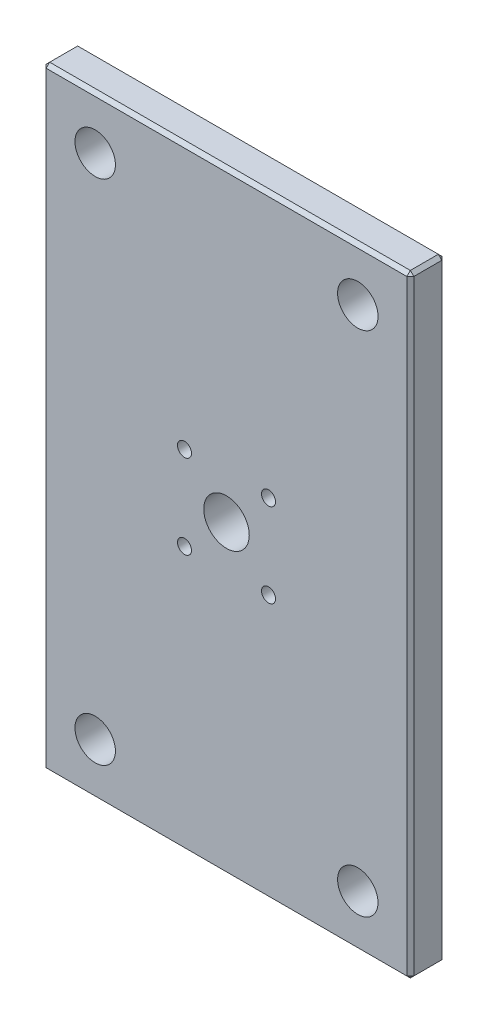
ISO-10303-21;
HEADER;
FILE_DESCRIPTION(('STEP AP214'),'2;1');
FILE_NAME('part.step','',(''),(''),'','','');
FILE_SCHEMA(('AUTOMOTIVE_DESIGN { 1 0 10303 214 1 1 1 1 }'));
ENDSEC;
DATA;
#1=APPLICATION_CONTEXT('core data for automotive mechanical design processes');
#2=APPLICATION_PROTOCOL_DEFINITION('international standard','automotive_design',2000,#1);
#3=PRODUCT_CONTEXT('',#1,'mechanical');
#4=PRODUCT('Part','Part','',(#3));
#5=PRODUCT_RELATED_PRODUCT_CATEGORY('part','',(#4));
#6=PRODUCT_DEFINITION_FORMATION('','',#4);
#7=PRODUCT_DEFINITION_CONTEXT('part definition',#1,'design');
#8=PRODUCT_DEFINITION('design','',#6,#7);
#9=PRODUCT_DEFINITION_SHAPE('','',#8);
#10=(LENGTH_UNIT() NAMED_UNIT(*) SI_UNIT(.MILLI.,.METRE.));
#11=(NAMED_UNIT(*) PLANE_ANGLE_UNIT() SI_UNIT($,.RADIAN.));
#12=(NAMED_UNIT(*) SI_UNIT($,.STERADIAN.) SOLID_ANGLE_UNIT());
#13=UNCERTAINTY_MEASURE_WITH_UNIT(LENGTH_MEASURE(1.E-05),#10,'distance_accuracy_value','');
#14=(GEOMETRIC_REPRESENTATION_CONTEXT(3) GLOBAL_UNCERTAINTY_ASSIGNED_CONTEXT((#13)) GLOBAL_UNIT_ASSIGNED_CONTEXT((#10,
#11,#12)) REPRESENTATION_CONTEXT('',''));
#15=CARTESIAN_POINT('',(0.,0.,0.));
#16=DIRECTION('',(0.,0.,1.));
#17=DIRECTION('',(1.,0.,0.));
#18=AXIS2_PLACEMENT_3D('',#15,#16,#17);
#19=CARTESIAN_POINT('',(0.,0.,40.));
#20=DIRECTION('',(1.,0.,0.));
#21=DIRECTION('',(0.,0.,-1.));
#22=AXIS2_PLACEMENT_3D('',#19,#20,#21);
#23=PLANE('',#22);
#24=DIRECTION('',(0.,0.,1.));
#25=VECTOR('',#24,1.);
#26=CARTESIAN_POINT('',(0.,4.,40.));
#27=LINE('',#26,#25);
#28=CARTESIAN_POINT('',(0.,4.,4.));
#29=VERTEX_POINT('',#28);
#30=CARTESIAN_POINT('',(0.,4.,36.));
#31=VERTEX_POINT('',#30);
#32=EDGE_CURVE('E238',#29,#31,#27,.T.);
#33=ORIENTED_EDGE('',*,*,#32,.T.);
#34=DIRECTION('',(0.,1.,0.));
#35=VECTOR('',#34,1.);
#36=CARTESIAN_POINT('',(0.,0.,36.));
#37=LINE('',#36,#35);
#38=CARTESIAN_POINT('',(0.,696.,36.));
#39=VERTEX_POINT('',#38);
#40=EDGE_CURVE('E240',#31,#39,#37,.T.);
#41=ORIENTED_EDGE('',*,*,#40,.T.);
#42=DIRECTION('',(0.,0.,-1.));
#43=VECTOR('',#42,1.);
#44=CARTESIAN_POINT('',(0.,696.,40.));
#45=LINE('',#44,#43);
#46=CARTESIAN_POINT('',(0.,696.,4.));
#47=VERTEX_POINT('',#46);
#48=EDGE_CURVE('E234',#39,#47,#45,.T.);
#49=ORIENTED_EDGE('',*,*,#48,.T.);
#50=DIRECTION('',(0.,-1.,0.));
#51=VECTOR('',#50,1.);
#52=CARTESIAN_POINT('',(0.,0.,4.));
#53=LINE('',#52,#51);
#54=EDGE_CURVE('E236',#47,#29,#53,.T.);
#55=ORIENTED_EDGE('',*,*,#54,.T.);
#56=EDGE_LOOP('',(#33,#41,#49,#55));
#57=FACE_BOUND('',#56,.T.);
#58=ADVANCED_FACE('F38',(#57),#23,.F.);
#59=CARTESIAN_POINT('',(0.,0.,40.));
#60=DIRECTION('',(0.,1.,0.));
#61=DIRECTION('',(0.,0.,1.));
#62=AXIS2_PLACEMENT_3D('',#59,#60,#61);
#63=PLANE('',#62);
#64=CARTESIAN_POINT('',(237.,0.,20.));
#65=DIRECTION('',(0.,-1.,0.));
#66=DIRECTION('',(0.,0.,-1.));
#67=AXIS2_PLACEMENT_3D('',#64,#65,#66);
#68=CIRCLE('',#67,1.64999999999998);
#69=CARTESIAN_POINT('',(237.,0.,18.35));
#70=VERTEX_POINT('',#69);
#71=EDGE_CURVE('E142',#70,#70,#68,.T.);
#72=ORIENTED_EDGE('',*,*,#71,.F.);
#73=EDGE_LOOP('',(#72));
#74=FACE_BOUND('',#73,.T.);
#75=CARTESIAN_POINT('',(183.,0.,20.));
#76=DIRECTION('',(0.,-1.,0.));
#77=DIRECTION('',(0.,0.,-1.));
#78=AXIS2_PLACEMENT_3D('',#75,#76,#77);
#79=CIRCLE('',#78,1.64999999999998);
#80=CARTESIAN_POINT('',(183.,0.,18.35));
#81=VERTEX_POINT('',#80);
#82=EDGE_CURVE('E141',#81,#81,#79,.T.);
#83=ORIENTED_EDGE('',*,*,#82,.F.);
#84=EDGE_LOOP('',(#83));
#85=FACE_BOUND('',#84,.T.);
#86=DIRECTION('',(-1.,0.,0.));
#87=VECTOR('',#86,1.);
#88=CARTESIAN_POINT('',(0.,0.,36.));
#89=LINE('',#88,#87);
#90=CARTESIAN_POINT('',(416.,0.,36.));
#91=VERTEX_POINT('',#90);
#92=CARTESIAN_POINT('',(4.,0.,36.));
#93=VERTEX_POINT('',#92);
#94=EDGE_CURVE('E220',#91,#93,#89,.T.);
#95=ORIENTED_EDGE('',*,*,#94,.T.);
#96=DIRECTION('',(0.,0.,-1.));
#97=VECTOR('',#96,1.);
#98=CARTESIAN_POINT('',(4.,0.,40.));
#99=LINE('',#98,#97);
#100=CARTESIAN_POINT('',(4.,0.,4.));
#101=VERTEX_POINT('',#100);
#102=EDGE_CURVE('E223',#93,#101,#99,.T.);
#103=ORIENTED_EDGE('',*,*,#102,.T.);
#104=DIRECTION('',(1.,0.,0.));
#105=VECTOR('',#104,1.);
#106=CARTESIAN_POINT('',(420.,0.,4.));
#107=LINE('',#106,#105);
#108=CARTESIAN_POINT('',(416.,0.,4.));
#109=VERTEX_POINT('',#108);
#110=EDGE_CURVE('E218',#101,#109,#107,.T.);
#111=ORIENTED_EDGE('',*,*,#110,.T.);
#112=DIRECTION('',(0.,0.,1.));
#113=VECTOR('',#112,1.);
#114=CARTESIAN_POINT('',(416.,0.,40.));
#115=LINE('',#114,#113);
#116=EDGE_CURVE('E216',#109,#91,#115,.T.);
#117=ORIENTED_EDGE('',*,*,#116,.T.);
#118=EDGE_LOOP('',(#95,#103,#111,#117));
#119=FACE_BOUND('',#118,.T.);
#120=ADVANCED_FACE('F400',(#74,#85,#119),#63,.F.);
#121=CARTESIAN_POINT('',(420.,0.,40.));
#122=DIRECTION('',(-1.,0.,0.));
#123=DIRECTION('',(0.,0.,1.));
#124=AXIS2_PLACEMENT_3D('',#121,#122,#123);
#125=PLANE('',#124);
#126=DIRECTION('',(0.,-1.,0.));
#127=VECTOR('',#126,1.);
#128=CARTESIAN_POINT('',(420.,0.,36.));
#129=LINE('',#128,#127);
#130=CARTESIAN_POINT('',(420.,696.,36.));
#131=VERTEX_POINT('',#130);
#132=CARTESIAN_POINT('',(420.,4.,36.));
#133=VERTEX_POINT('',#132);
#134=EDGE_CURVE('E47',#131,#133,#129,.T.);
#135=ORIENTED_EDGE('',*,*,#134,.T.);
#136=DIRECTION('',(0.,0.,-1.));
#137=VECTOR('',#136,1.);
#138=CARTESIAN_POINT('',(420.,4.,40.));
#139=LINE('',#138,#137);
#140=CARTESIAN_POINT('',(420.,4.,4.));
#141=VERTEX_POINT('',#140);
#142=EDGE_CURVE('E11',#133,#141,#139,.T.);
#143=ORIENTED_EDGE('',*,*,#142,.T.);
#144=DIRECTION('',(0.,1.,0.));
#145=VECTOR('',#144,1.);
#146=CARTESIAN_POINT('',(420.,700.,4.));
#147=LINE('',#146,#145);
#148=CARTESIAN_POINT('',(420.,696.,4.));
#149=VERTEX_POINT('',#148);
#150=EDGE_CURVE('E252',#141,#149,#147,.T.);
#151=ORIENTED_EDGE('',*,*,#150,.T.);
#152=DIRECTION('',(0.,0.,1.));
#153=VECTOR('',#152,1.);
#154=CARTESIAN_POINT('',(420.,696.,40.));
#155=LINE('',#154,#153);
#156=EDGE_CURVE('E58',#149,#131,#155,.T.);
#157=ORIENTED_EDGE('',*,*,#156,.T.);
#158=EDGE_LOOP('',(#135,#143,#151,#157));
#159=FACE_BOUND('',#158,.T.);
#160=ADVANCED_FACE('F405',(#159),#125,.F.);
#161=CARTESIAN_POINT('',(0.,700.,40.));
#162=DIRECTION('',(0.,-1.,0.));
#163=DIRECTION('',(0.,0.,-1.));
#164=AXIS2_PLACEMENT_3D('',#161,#162,#163);
#165=PLANE('',#164);
#166=DIRECTION('',(0.,0.,1.));
#167=VECTOR('',#166,1.);
#168=CARTESIAN_POINT('',(4.,700.,40.));
#169=LINE('',#168,#167);
#170=CARTESIAN_POINT('',(4.,700.,4.));
#171=VERTEX_POINT('',#170);
#172=CARTESIAN_POINT('',(4.,700.,36.));
#173=VERTEX_POINT('',#172);
#174=EDGE_CURVE('E247',#171,#173,#169,.T.);
#175=ORIENTED_EDGE('',*,*,#174,.T.);
#176=DIRECTION('',(1.,0.,0.));
#177=VECTOR('',#176,1.);
#178=CARTESIAN_POINT('',(0.,700.,36.));
#179=LINE('',#178,#177);
#180=CARTESIAN_POINT('',(416.,700.,36.));
#181=VERTEX_POINT('',#180);
#182=EDGE_CURVE('E249',#173,#181,#179,.T.);
#183=ORIENTED_EDGE('',*,*,#182,.T.);
#184=DIRECTION('',(0.,0.,-1.));
#185=VECTOR('',#184,1.);
#186=CARTESIAN_POINT('',(416.,700.,40.));
#187=LINE('',#186,#185);
#188=CARTESIAN_POINT('',(416.,700.,4.));
#189=VERTEX_POINT('',#188);
#190=EDGE_CURVE('E243',#181,#189,#187,.T.);
#191=ORIENTED_EDGE('',*,*,#190,.T.);
#192=DIRECTION('',(-1.,0.,0.));
#193=VECTOR('',#192,1.);
#194=CARTESIAN_POINT('',(0.,700.,4.));
#195=LINE('',#194,#193);
#196=EDGE_CURVE('E245',#189,#171,#195,.T.);
#197=ORIENTED_EDGE('',*,*,#196,.T.);
#198=EDGE_LOOP('',(#175,#183,#191,#197));
#199=FACE_BOUND('',#198,.T.);
#200=ADVANCED_FACE('F345',(#199),#165,.F.);
#201=CARTESIAN_POINT('',(0.,0.,40.));
#202=DIRECTION('',(0.,0.,-1.));
#203=DIRECTION('',(-1.,0.,0.));
#204=AXIS2_PLACEMENT_3D('',#201,#202,#203);
#205=PLANE('',#204);
#206=DIRECTION('',(0.,-1.,0.));
#207=VECTOR('',#206,1.);
#208=CARTESIAN_POINT('',(4.,0.,40.));
#209=LINE('',#208,#207);
#210=CARTESIAN_POINT('',(4.,696.,40.));
#211=VERTEX_POINT('',#210);
#212=CARTESIAN_POINT('',(4.,4.,40.));
#213=VERTEX_POINT('',#212);
#214=EDGE_CURVE('E211',#211,#213,#209,.T.);
#215=ORIENTED_EDGE('',*,*,#214,.T.);
#216=DIRECTION('',(1.,0.,0.));
#217=VECTOR('',#216,1.);
#218=CARTESIAN_POINT('',(0.,4.,40.));
#219=LINE('',#218,#217);
#220=CARTESIAN_POINT('',(416.,4.,40.));
#221=VERTEX_POINT('',#220);
#222=EDGE_CURVE('E213',#213,#221,#219,.T.);
#223=ORIENTED_EDGE('',*,*,#222,.T.);
#224=DIRECTION('',(0.,1.,0.));
#225=VECTOR('',#224,1.);
#226=CARTESIAN_POINT('',(416.,0.,40.));
#227=LINE('',#226,#225);
#228=CARTESIAN_POINT('',(416.,696.,40.));
#229=VERTEX_POINT('',#228);
#230=EDGE_CURVE('E205',#221,#229,#227,.T.);
#231=ORIENTED_EDGE('',*,*,#230,.T.);
#232=DIRECTION('',(-1.,0.,0.));
#233=VECTOR('',#232,1.);
#234=CARTESIAN_POINT('',(0.,696.,40.));
#235=LINE('',#234,#233);
#236=EDGE_CURVE('E209',#229,#211,#235,.T.);
#237=ORIENTED_EDGE('',*,*,#236,.T.);
#238=EDGE_LOOP('',(#215,#223,#231,#237));
#239=FACE_BOUND('',#238,.T.);
#240=CARTESIAN_POINT('',(162.,398.,40.));
#241=DIRECTION('',(0.,0.,1.));
#242=DIRECTION('',(1.,0.,0.));
#243=AXIS2_PLACEMENT_3D('',#240,#241,#242);
#244=CIRCLE('',#243,8.00000000000001);
#245=CARTESIAN_POINT('',(170.,398.,40.));
#246=VERTEX_POINT('',#245);
#247=EDGE_CURVE('E153',#246,#246,#244,.T.);
#248=ORIENTED_EDGE('',*,*,#247,.F.);
#249=EDGE_LOOP('',(#248));
#250=FACE_BOUND('',#249,.T.);
#251=CARTESIAN_POINT('',(258.,398.,40.));
#252=DIRECTION('',(0.,0.,1.));
#253=DIRECTION('',(1.,0.,0.));
#254=AXIS2_PLACEMENT_3D('',#251,#252,#253);
#255=CIRCLE('',#254,8.00000000000001);
#256=CARTESIAN_POINT('',(266.,398.,40.));
#257=VERTEX_POINT('',#256);
#258=EDGE_CURVE('E159',#257,#257,#255,.T.);
#259=ORIENTED_EDGE('',*,*,#258,.F.);
#260=EDGE_LOOP('',(#259));
#261=FACE_BOUND('',#260,.T.);
#262=CARTESIAN_POINT('',(258.,302.,40.));
#263=DIRECTION('',(0.,0.,1.));
#264=DIRECTION('',(1.,0.,0.));
#265=AXIS2_PLACEMENT_3D('',#262,#263,#264);
#266=CIRCLE('',#265,8.00000000000001);
#267=CARTESIAN_POINT('',(266.,302.,40.));
#268=VERTEX_POINT('',#267);
#269=EDGE_CURVE('E165',#268,#268,#266,.T.);
#270=ORIENTED_EDGE('',*,*,#269,.F.);
#271=EDGE_LOOP('',(#270));
#272=FACE_BOUND('',#271,.T.);
#273=CARTESIAN_POINT('',(162.,302.,40.));
#274=DIRECTION('',(0.,0.,1.));
#275=DIRECTION('',(1.,0.,0.));
#276=AXIS2_PLACEMENT_3D('',#273,#274,#275);
#277=CIRCLE('',#276,8.00000000000001);
#278=CARTESIAN_POINT('',(170.,302.,40.));
#279=VERTEX_POINT('',#278);
#280=EDGE_CURVE('E171',#279,#279,#277,.T.);
#281=ORIENTED_EDGE('',*,*,#280,.F.);
#282=EDGE_LOOP('',(#281));
#283=FACE_BOUND('',#282,.T.);
#284=CARTESIAN_POINT('',(210.,350.,40.));
#285=DIRECTION('',(0.,0.,1.));
#286=DIRECTION('',(1.,0.,0.));
#287=AXIS2_PLACEMENT_3D('',#284,#285,#286);
#288=CIRCLE('',#287,26.);
#289=CARTESIAN_POINT('',(236.,350.,40.));
#290=VERTEX_POINT('',#289);
#291=EDGE_CURVE('E177',#290,#290,#288,.T.);
#292=ORIENTED_EDGE('',*,*,#291,.F.);
#293=EDGE_LOOP('',(#292));
#294=FACE_BOUND('',#293,.T.);
#295=CARTESIAN_POINT('',(60.,640.,40.));
#296=DIRECTION('',(0.,0.,1.));
#297=DIRECTION('',(1.,0.,0.));
#298=AXIS2_PLACEMENT_3D('',#295,#296,#297);
#299=CIRCLE('',#298,23.1);
#300=CARTESIAN_POINT('',(83.1,640.,40.));
#301=VERTEX_POINT('',#300);
#302=EDGE_CURVE('E181',#301,#301,#299,.T.);
#303=ORIENTED_EDGE('',*,*,#302,.F.);
#304=EDGE_LOOP('',(#303));
#305=FACE_BOUND('',#304,.T.);
#306=CARTESIAN_POINT('',(360.,640.,40.));
#307=DIRECTION('',(0.,0.,1.));
#308=DIRECTION('',(1.,0.,0.));
#309=AXIS2_PLACEMENT_3D('',#306,#307,#308);
#310=CIRCLE('',#309,23.1);
#311=CARTESIAN_POINT('',(383.1,640.,40.));
#312=VERTEX_POINT('',#311);
#313=EDGE_CURVE('E187',#312,#312,#310,.T.);
#314=ORIENTED_EDGE('',*,*,#313,.F.);
#315=EDGE_LOOP('',(#314));
#316=FACE_BOUND('',#315,.T.);
#317=CARTESIAN_POINT('',(360.,60.,40.));
#318=DIRECTION('',(0.,0.,1.));
#319=DIRECTION('',(1.,0.,0.));
#320=AXIS2_PLACEMENT_3D('',#317,#318,#319);
#321=CIRCLE('',#320,23.1);
#322=CARTESIAN_POINT('',(383.1,60.,40.));
#323=VERTEX_POINT('',#322);
#324=EDGE_CURVE('E193',#323,#323,#321,.T.);
#325=ORIENTED_EDGE('',*,*,#324,.F.);
#326=EDGE_LOOP('',(#325));
#327=FACE_BOUND('',#326,.T.);
#328=CARTESIAN_POINT('',(60.,60.0000000000001,40.));
#329=DIRECTION('',(0.,0.,1.));
#330=DIRECTION('',(1.,0.,0.));
#331=AXIS2_PLACEMENT_3D('',#328,#329,#330);
#332=CIRCLE('',#331,23.1);
#333=CARTESIAN_POINT('',(83.1,60.0000000000001,40.));
#334=VERTEX_POINT('',#333);
#335=EDGE_CURVE('E199',#334,#334,#332,.T.);
#336=ORIENTED_EDGE('',*,*,#335,.F.);
#337=EDGE_LOOP('',(#336));
#338=FACE_BOUND('',#337,.T.);
#339=ADVANCED_FACE('F445',(#239,#250,#261,#272,#283,#294,#305,#316,#327,#338),#205,.F.);
#340=CARTESIAN_POINT('',(0.,0.,0.));
#341=DIRECTION('',(0.,0.,-1.));
#342=DIRECTION('',(-1.,0.,0.));
#343=AXIS2_PLACEMENT_3D('',#340,#341,#342);
#344=PLANE('',#343);
#345=DIRECTION('',(0.,-1.,0.));
#346=VECTOR('',#345,1.);
#347=CARTESIAN_POINT('',(416.,0.,0.));
#348=LINE('',#347,#346);
#349=CARTESIAN_POINT('',(416.,696.,0.));
#350=VERTEX_POINT('',#349);
#351=CARTESIAN_POINT('',(416.,4.,0.));
#352=VERTEX_POINT('',#351);
#353=EDGE_CURVE('E225',#350,#352,#348,.T.);
#354=ORIENTED_EDGE('',*,*,#353,.T.);
#355=DIRECTION('',(-1.,0.,0.));
#356=VECTOR('',#355,1.);
#357=CARTESIAN_POINT('',(0.,4.,0.));
#358=LINE('',#357,#356);
#359=CARTESIAN_POINT('',(4.,4.,0.));
#360=VERTEX_POINT('',#359);
#361=EDGE_CURVE('E231',#352,#360,#358,.T.);
#362=ORIENTED_EDGE('',*,*,#361,.T.);
#363=DIRECTION('',(0.,1.,0.));
#364=VECTOR('',#363,1.);
#365=CARTESIAN_POINT('',(4.,700.,0.));
#366=LINE('',#365,#364);
#367=CARTESIAN_POINT('',(4.,696.,0.));
#368=VERTEX_POINT('',#367);
#369=EDGE_CURVE('E229',#360,#368,#366,.T.);
#370=ORIENTED_EDGE('',*,*,#369,.T.);
#371=DIRECTION('',(1.,0.,0.));
#372=VECTOR('',#371,1.);
#373=CARTESIAN_POINT('',(420.,696.,0.));
#374=LINE('',#373,#372);
#375=EDGE_CURVE('E227',#368,#350,#374,.T.);
#376=ORIENTED_EDGE('',*,*,#375,.T.);
#377=EDGE_LOOP('',(#354,#362,#370,#376));
#378=FACE_BOUND('',#377,.T.);
#379=CARTESIAN_POINT('',(162.,398.,0.));
#380=DIRECTION('',(0.,0.,1.));
#381=DIRECTION('',(1.,0.,0.));
#382=AXIS2_PLACEMENT_3D('',#379,#380,#381);
#383=CIRCLE('',#382,7.99999999999998);
#384=CARTESIAN_POINT('',(170.,398.,0.));
#385=VERTEX_POINT('',#384);
#386=EDGE_CURVE('E156',#385,#385,#383,.T.);
#387=ORIENTED_EDGE('',*,*,#386,.T.);
#388=EDGE_LOOP('',(#387));
#389=FACE_BOUND('',#388,.T.);
#390=CARTESIAN_POINT('',(258.,398.,0.));
#391=DIRECTION('',(0.,0.,1.));
#392=DIRECTION('',(1.,0.,0.));
#393=AXIS2_PLACEMENT_3D('',#390,#391,#392);
#394=CIRCLE('',#393,8.00000000000001);
#395=CARTESIAN_POINT('',(266.,398.,0.));
#396=VERTEX_POINT('',#395);
#397=EDGE_CURVE('E162',#396,#396,#394,.T.);
#398=ORIENTED_EDGE('',*,*,#397,.T.);
#399=EDGE_LOOP('',(#398));
#400=FACE_BOUND('',#399,.T.);
#401=CARTESIAN_POINT('',(258.,302.,0.));
#402=DIRECTION('',(0.,0.,1.));
#403=DIRECTION('',(1.,0.,0.));
#404=AXIS2_PLACEMENT_3D('',#401,#402,#403);
#405=CIRCLE('',#404,8.00000000000001);
#406=CARTESIAN_POINT('',(266.,302.,0.));
#407=VERTEX_POINT('',#406);
#408=EDGE_CURVE('E168',#407,#407,#405,.T.);
#409=ORIENTED_EDGE('',*,*,#408,.T.);
#410=EDGE_LOOP('',(#409));
#411=FACE_BOUND('',#410,.T.);
#412=CARTESIAN_POINT('',(162.,302.,0.));
#413=DIRECTION('',(0.,0.,1.));
#414=DIRECTION('',(1.,0.,0.));
#415=AXIS2_PLACEMENT_3D('',#412,#413,#414);
#416=CIRCLE('',#415,7.99999999999998);
#417=CARTESIAN_POINT('',(170.,302.,0.));
#418=VERTEX_POINT('',#417);
#419=EDGE_CURVE('E174',#418,#418,#416,.T.);
#420=ORIENTED_EDGE('',*,*,#419,.T.);
#421=EDGE_LOOP('',(#420));
#422=FACE_BOUND('',#421,.T.);
#423=CARTESIAN_POINT('',(210.,350.,0.));
#424=DIRECTION('',(0.,0.,1.));
#425=DIRECTION('',(1.,0.,0.));
#426=AXIS2_PLACEMENT_3D('',#423,#424,#425);
#427=CIRCLE('',#426,26.);
#428=CARTESIAN_POINT('',(236.,350.,0.));
#429=VERTEX_POINT('',#428);
#430=EDGE_CURVE('E178',#429,#429,#427,.T.);
#431=ORIENTED_EDGE('',*,*,#430,.T.);
#432=EDGE_LOOP('',(#431));
#433=FACE_BOUND('',#432,.T.);
#434=CARTESIAN_POINT('',(60.,640.,0.));
#435=DIRECTION('',(0.,0.,1.));
#436=DIRECTION('',(1.,0.,0.));
#437=AXIS2_PLACEMENT_3D('',#434,#435,#436);
#438=CIRCLE('',#437,23.1);
#439=CARTESIAN_POINT('',(83.1,640.,0.));
#440=VERTEX_POINT('',#439);
#441=EDGE_CURVE('E184',#440,#440,#438,.T.);
#442=ORIENTED_EDGE('',*,*,#441,.T.);
#443=EDGE_LOOP('',(#442));
#444=FACE_BOUND('',#443,.T.);
#445=CARTESIAN_POINT('',(360.,640.,0.));
#446=DIRECTION('',(0.,0.,1.));
#447=DIRECTION('',(1.,0.,0.));
#448=AXIS2_PLACEMENT_3D('',#445,#446,#447);
#449=CIRCLE('',#448,23.1);
#450=CARTESIAN_POINT('',(383.1,640.,0.));
#451=VERTEX_POINT('',#450);
#452=EDGE_CURVE('E190',#451,#451,#449,.T.);
#453=ORIENTED_EDGE('',*,*,#452,.T.);
#454=EDGE_LOOP('',(#453));
#455=FACE_BOUND('',#454,.T.);
#456=CARTESIAN_POINT('',(360.,60.,0.));
#457=DIRECTION('',(0.,0.,1.));
#458=DIRECTION('',(1.,0.,0.));
#459=AXIS2_PLACEMENT_3D('',#456,#457,#458);
#460=CIRCLE('',#459,23.1);
#461=CARTESIAN_POINT('',(383.1,60.,0.));
#462=VERTEX_POINT('',#461);
#463=EDGE_CURVE('E196',#462,#462,#460,.T.);
#464=ORIENTED_EDGE('',*,*,#463,.T.);
#465=EDGE_LOOP('',(#464));
#466=FACE_BOUND('',#465,.T.);
#467=CARTESIAN_POINT('',(60.,60.0000000000001,0.));
#468=DIRECTION('',(0.,0.,1.));
#469=DIRECTION('',(1.,0.,0.));
#470=AXIS2_PLACEMENT_3D('',#467,#468,#469);
#471=CIRCLE('',#470,23.1);
#472=CARTESIAN_POINT('',(83.1,60.0000000000001,0.));
#473=VERTEX_POINT('',#472);
#474=EDGE_CURVE('E202',#473,#473,#471,.T.);
#475=ORIENTED_EDGE('',*,*,#474,.T.);
#476=EDGE_LOOP('',(#475));
#477=FACE_BOUND('',#476,.T.);
#478=ADVANCED_FACE('F365',(#378,#389,#400,#411,#422,#433,#444,#455,#466,#477),#344,.T.);
#479=CARTESIAN_POINT('',(60.,60.0000000000001,0.));
#480=DIRECTION('',(0.,0.,1.));
#481=DIRECTION('',(1.,0.,0.));
#482=AXIS2_PLACEMENT_3D('',#479,#480,#481);
#483=CYLINDRICAL_SURFACE('',#482,23.1);
#484=ORIENTED_EDGE('',*,*,#474,.F.);
#485=EDGE_LOOP('',(#484));
#486=FACE_BOUND('',#485,.T.);
#487=ORIENTED_EDGE('',*,*,#335,.T.);
#488=EDGE_LOOP('',(#487));
#489=FACE_BOUND('',#488,.T.);
#490=ADVANCED_FACE('F467',(#486,#489),#483,.F.);
#491=CARTESIAN_POINT('',(360.,60.,0.));
#492=DIRECTION('',(0.,0.,1.));
#493=DIRECTION('',(1.,0.,0.));
#494=AXIS2_PLACEMENT_3D('',#491,#492,#493);
#495=CYLINDRICAL_SURFACE('',#494,23.1);
#496=ORIENTED_EDGE('',*,*,#463,.F.);
#497=EDGE_LOOP('',(#496));
#498=FACE_BOUND('',#497,.T.);
#499=ORIENTED_EDGE('',*,*,#324,.T.);
#500=EDGE_LOOP('',(#499));
#501=FACE_BOUND('',#500,.T.);
#502=ADVANCED_FACE('F469',(#498,#501),#495,.F.);
#503=CARTESIAN_POINT('',(360.,640.,0.));
#504=DIRECTION('',(0.,0.,1.));
#505=DIRECTION('',(1.,0.,0.));
#506=AXIS2_PLACEMENT_3D('',#503,#504,#505);
#507=CYLINDRICAL_SURFACE('',#506,23.1);
#508=ORIENTED_EDGE('',*,*,#452,.F.);
#509=EDGE_LOOP('',(#508));
#510=FACE_BOUND('',#509,.T.);
#511=ORIENTED_EDGE('',*,*,#313,.T.);
#512=EDGE_LOOP('',(#511));
#513=FACE_BOUND('',#512,.T.);
#514=ADVANCED_FACE('F476',(#510,#513),#507,.F.);
#515=CARTESIAN_POINT('',(60.,640.,0.));
#516=DIRECTION('',(0.,0.,1.));
#517=DIRECTION('',(1.,0.,0.));
#518=AXIS2_PLACEMENT_3D('',#515,#516,#517);
#519=CYLINDRICAL_SURFACE('',#518,23.1);
#520=ORIENTED_EDGE('',*,*,#441,.F.);
#521=EDGE_LOOP('',(#520));
#522=FACE_BOUND('',#521,.T.);
#523=ORIENTED_EDGE('',*,*,#302,.T.);
#524=EDGE_LOOP('',(#523));
#525=FACE_BOUND('',#524,.T.);
#526=ADVANCED_FACE('F522',(#522,#525),#519,.F.);
#527=CARTESIAN_POINT('',(210.,350.,0.));
#528=DIRECTION('',(0.,0.,1.));
#529=DIRECTION('',(1.,0.,0.));
#530=AXIS2_PLACEMENT_3D('',#527,#528,#529);
#531=CYLINDRICAL_SURFACE('',#530,26.);
#532=ORIENTED_EDGE('',*,*,#430,.F.);
#533=EDGE_LOOP('',(#532));
#534=FACE_BOUND('',#533,.T.);
#535=ORIENTED_EDGE('',*,*,#291,.T.);
#536=EDGE_LOOP('',(#535));
#537=FACE_BOUND('',#536,.T.);
#538=ADVANCED_FACE('F531',(#534,#537),#531,.F.);
#539=CARTESIAN_POINT('',(162.,302.,40.));
#540=DIRECTION('',(0.,0.,1.));
#541=DIRECTION('',(1.,0.,0.));
#542=AXIS2_PLACEMENT_3D('',#539,#540,#541);
#543=CYLINDRICAL_SURFACE('',#542,7.99999999999999);
#544=ORIENTED_EDGE('',*,*,#419,.F.);
#545=EDGE_LOOP('',(#544));
#546=FACE_BOUND('',#545,.T.);
#547=ORIENTED_EDGE('',*,*,#280,.T.);
#548=EDGE_LOOP('',(#547));
#549=FACE_BOUND('',#548,.T.);
#550=ADVANCED_FACE('F541',(#546,#549),#543,.F.);
#551=CARTESIAN_POINT('',(258.,302.,40.));
#552=DIRECTION('',(0.,0.,1.));
#553=DIRECTION('',(1.,0.,0.));
#554=AXIS2_PLACEMENT_3D('',#551,#552,#553);
#555=CYLINDRICAL_SURFACE('',#554,8.00000000000001);
#556=ORIENTED_EDGE('',*,*,#408,.F.);
#557=EDGE_LOOP('',(#556));
#558=FACE_BOUND('',#557,.T.);
#559=ORIENTED_EDGE('',*,*,#269,.T.);
#560=EDGE_LOOP('',(#559));
#561=FACE_BOUND('',#560,.T.);
#562=ADVANCED_FACE('F780',(#558,#561),#555,.F.);
#563=CARTESIAN_POINT('',(258.,398.,40.));
#564=DIRECTION('',(0.,0.,1.));
#565=DIRECTION('',(1.,0.,0.));
#566=AXIS2_PLACEMENT_3D('',#563,#564,#565);
#567=CYLINDRICAL_SURFACE('',#566,8.00000000000001);
#568=ORIENTED_EDGE('',*,*,#397,.F.);
#569=EDGE_LOOP('',(#568));
#570=FACE_BOUND('',#569,.T.);
#571=ORIENTED_EDGE('',*,*,#258,.T.);
#572=EDGE_LOOP('',(#571));
#573=FACE_BOUND('',#572,.T.);
#574=ADVANCED_FACE('F770',(#570,#573),#567,.F.);
#575=CARTESIAN_POINT('',(162.,398.,40.));
#576=DIRECTION('',(0.,0.,1.));
#577=DIRECTION('',(1.,0.,0.));
#578=AXIS2_PLACEMENT_3D('',#575,#576,#577);
#579=CYLINDRICAL_SURFACE('',#578,7.99999999999999);
#580=ORIENTED_EDGE('',*,*,#386,.F.);
#581=EDGE_LOOP('',(#580));
#582=FACE_BOUND('',#581,.T.);
#583=ORIENTED_EDGE('',*,*,#247,.T.);
#584=EDGE_LOOP('',(#583));
#585=FACE_BOUND('',#584,.T.);
#586=ADVANCED_FACE('F552',(#582,#585),#579,.F.);
#587=CARTESIAN_POINT('',(0.,700.,4.));
#588=DIRECTION('',(0.,0.707106781186547,-0.707106781186547));
#589=DIRECTION('',(1.,0.,0.));
#590=AXIS2_PLACEMENT_3D('',#587,#588,#589);
#591=PLANE('',#590);
#592=DIRECTION('',(0.,-0.707106781186547,-0.707106781186547));
#593=VECTOR('',#592,1.);
#594=CARTESIAN_POINT('',(4.,696.,0.));
#595=LINE('',#594,#593);
#596=EDGE_CURVE('E42',#171,#368,#595,.T.);
#597=ORIENTED_EDGE('',*,*,#596,.F.);
#598=ORIENTED_EDGE('',*,*,#196,.F.);
#599=DIRECTION('',(0.,0.707106781186547,0.707106781186547));
#600=VECTOR('',#599,1.);
#601=CARTESIAN_POINT('',(416.,696.,0.));
#602=LINE('',#601,#600);
#603=EDGE_CURVE('E314',#350,#189,#602,.T.);
#604=ORIENTED_EDGE('',*,*,#603,.F.);
#605=ORIENTED_EDGE('',*,*,#375,.F.);
#606=EDGE_LOOP('',(#597,#598,#604,#605));
#607=FACE_BOUND('',#606,.T.);
#608=ADVANCED_FACE('F40',(#607),#591,.T.);
#609=CARTESIAN_POINT('',(4.,696.,0.));
#610=DIRECTION('',(-0.577350269189626,0.577350269189626,-0.577350269189626));
#611=DIRECTION('',(-0.707106781186547,0.,0.707106781186547));
#612=AXIS2_PLACEMENT_3D('',#609,#610,#611);
#613=PLANE('',#612);
#614=DIRECTION('',(-0.707106781186547,-0.707106781186547,0.));
#615=VECTOR('',#614,1.);
#616=CARTESIAN_POINT('',(2.,698.,4.));
#617=LINE('',#616,#615);
#618=EDGE_CURVE('E309',#171,#47,#617,.T.);
#619=ORIENTED_EDGE('',*,*,#618,.F.);
#620=ORIENTED_EDGE('',*,*,#596,.T.);
#621=DIRECTION('',(-0.707106781186547,0.,0.707106781186547));
#622=VECTOR('',#621,1.);
#623=CARTESIAN_POINT('',(4.,696.,0.));
#624=LINE('',#623,#622);
#625=EDGE_CURVE('E312',#47,#368,#624,.F.);
#626=ORIENTED_EDGE('',*,*,#625,.F.);
#627=EDGE_LOOP('',(#619,#620,#626));
#628=FACE_BOUND('',#627,.T.);
#629=ADVANCED_FACE('F325',(#628),#613,.T.);
#630=CARTESIAN_POINT('',(416.,696.,0.));
#631=DIRECTION('',(0.577350269189626,0.577350269189626,-0.577350269189626));
#632=DIRECTION('',(-0.707106781186547,0.,-0.707106781186547));
#633=AXIS2_PLACEMENT_3D('',#630,#631,#632);
#634=PLANE('',#633);
#635=DIRECTION('',(-0.707106781186547,0.,-0.707106781186547));
#636=VECTOR('',#635,1.);
#637=CARTESIAN_POINT('',(416.,696.,0.));
#638=LINE('',#637,#636);
#639=EDGE_CURVE('E303',#350,#149,#638,.F.);
#640=ORIENTED_EDGE('',*,*,#639,.F.);
#641=ORIENTED_EDGE('',*,*,#603,.T.);
#642=DIRECTION('',(-0.707106781186547,0.707106781186547,0.));
#643=VECTOR('',#642,1.);
#644=CARTESIAN_POINT('',(418.,698.,4.));
#645=LINE('',#644,#643);
#646=EDGE_CURVE('E306',#149,#189,#645,.T.);
#647=ORIENTED_EDGE('',*,*,#646,.F.);
#648=EDGE_LOOP('',(#640,#641,#647));
#649=FACE_BOUND('',#648,.T.);
#650=ADVANCED_FACE('F358',(#649),#634,.T.);
#651=CARTESIAN_POINT('',(0.,0.,4.));
#652=DIRECTION('',(-0.707106781186547,0.,-0.707106781186547));
#653=DIRECTION('',(0.,1.,0.));
#654=AXIS2_PLACEMENT_3D('',#651,#652,#653);
#655=PLANE('',#654);
#656=ORIENTED_EDGE('',*,*,#625,.T.);
#657=ORIENTED_EDGE('',*,*,#369,.F.);
#658=DIRECTION('',(0.707106781186547,0.,-0.707106781186547));
#659=VECTOR('',#658,1.);
#660=CARTESIAN_POINT('',(4.,4.,0.));
#661=LINE('',#660,#659);
#662=EDGE_CURVE('E298',#29,#360,#661,.T.);
#663=ORIENTED_EDGE('',*,*,#662,.F.);
#664=ORIENTED_EDGE('',*,*,#54,.F.);
#665=EDGE_LOOP('',(#656,#657,#663,#664));
#666=FACE_BOUND('',#665,.T.);
#667=ADVANCED_FACE('F333',(#666),#655,.T.);
#668=CARTESIAN_POINT('',(0.,696.,40.));
#669=DIRECTION('',(0.707106781186547,-0.707106781186547,0.));
#670=DIRECTION('',(0.,0.,-1.));
#671=AXIS2_PLACEMENT_3D('',#668,#669,#670);
#672=PLANE('',#671);
#673=ORIENTED_EDGE('',*,*,#618,.T.);
#674=ORIENTED_EDGE('',*,*,#48,.F.);
#675=DIRECTION('',(0.707106781186547,0.707106781186547,0.));
#676=VECTOR('',#675,1.);
#677=CARTESIAN_POINT('',(0.,696.,36.));
#678=LINE('',#677,#676);
#679=EDGE_CURVE('E295',#173,#39,#678,.F.);
#680=ORIENTED_EDGE('',*,*,#679,.F.);
#681=ORIENTED_EDGE('',*,*,#174,.F.);
#682=EDGE_LOOP('',(#673,#674,#680,#681));
#683=FACE_BOUND('',#682,.T.);
#684=ADVANCED_FACE('F342',(#683),#672,.F.);
#685=CARTESIAN_POINT('',(0.,696.,40.));
#686=DIRECTION('',(0.,-0.707106781186547,-0.707106781186547));
#687=DIRECTION('',(-1.,0.,0.));
#688=AXIS2_PLACEMENT_3D('',#685,#686,#687);
#689=PLANE('',#688);
#690=DIRECTION('',(0.,0.707106781186547,-0.707106781186547));
#691=VECTOR('',#690,1.);
#692=CARTESIAN_POINT('',(416.,700.,36.));
#693=LINE('',#692,#691);
#694=EDGE_CURVE('E289',#181,#229,#693,.F.);
#695=ORIENTED_EDGE('',*,*,#694,.F.);
#696=ORIENTED_EDGE('',*,*,#182,.F.);
#697=DIRECTION('',(0.,-0.707106781186547,0.707106781186547));
#698=VECTOR('',#697,1.);
#699=CARTESIAN_POINT('',(4.,698.,38.));
#700=LINE('',#699,#698);
#701=EDGE_CURVE('E292',#211,#173,#700,.F.);
#702=ORIENTED_EDGE('',*,*,#701,.F.);
#703=ORIENTED_EDGE('',*,*,#236,.F.);
#704=EDGE_LOOP('',(#695,#696,#702,#703));
#705=FACE_BOUND('',#704,.T.);
#706=ADVANCED_FACE('F349',(#705),#689,.F.);
#707=CARTESIAN_POINT('',(416.,700.,40.));
#708=DIRECTION('',(-0.707106781186547,-0.707106781186547,0.));
#709=DIRECTION('',(0.,0.,-1.));
#710=AXIS2_PLACEMENT_3D('',#707,#708,#709);
#711=PLANE('',#710);
#712=ORIENTED_EDGE('',*,*,#646,.T.);
#713=ORIENTED_EDGE('',*,*,#190,.F.);
#714=DIRECTION('',(0.707106781186547,-0.707106781186547,0.));
#715=VECTOR('',#714,1.);
#716=CARTESIAN_POINT('',(416.,700.,36.));
#717=LINE('',#716,#715);
#718=EDGE_CURVE('E287',#131,#181,#717,.F.);
#719=ORIENTED_EDGE('',*,*,#718,.F.);
#720=ORIENTED_EDGE('',*,*,#156,.F.);
#721=EDGE_LOOP('',(#712,#713,#719,#720));
#722=FACE_BOUND('',#721,.T.);
#723=ADVANCED_FACE('F356',(#722),#711,.F.);
#724=CARTESIAN_POINT('',(420.,0.,4.));
#725=DIRECTION('',(0.707106781186547,0.,-0.707106781186547));
#726=DIRECTION('',(0.,-1.,0.));
#727=AXIS2_PLACEMENT_3D('',#724,#725,#726);
#728=PLANE('',#727);
#729=ORIENTED_EDGE('',*,*,#639,.T.);
#730=ORIENTED_EDGE('',*,*,#150,.F.);
#731=DIRECTION('',(0.707106781186547,0.,0.707106781186547));
#732=VECTOR('',#731,1.);
#733=CARTESIAN_POINT('',(418.,4.,2.));
#734=LINE('',#733,#732);
#735=EDGE_CURVE('E284',#352,#141,#734,.T.);
#736=ORIENTED_EDGE('',*,*,#735,.F.);
#737=ORIENTED_EDGE('',*,*,#353,.F.);
#738=EDGE_LOOP('',(#729,#730,#736,#737));
#739=FACE_BOUND('',#738,.T.);
#740=ADVANCED_FACE('F362',(#739),#728,.T.);
#741=CARTESIAN_POINT('',(0.,0.,4.));
#742=DIRECTION('',(0.,-0.707106781186547,-0.707106781186547));
#743=DIRECTION('',(-1.,0.,0.));
#744=AXIS2_PLACEMENT_3D('',#741,#742,#743);
#745=PLANE('',#744);
#746=DIRECTION('',(0.,-0.707106781186547,0.707106781186547));
#747=VECTOR('',#746,1.);
#748=CARTESIAN_POINT('',(4.,4.,0.));
#749=LINE('',#748,#747);
#750=EDGE_CURVE('E300',#360,#101,#749,.T.);
#751=ORIENTED_EDGE('',*,*,#750,.F.);
#752=ORIENTED_EDGE('',*,*,#361,.F.);
#753=DIRECTION('',(0.,0.707106781186547,-0.707106781186547));
#754=VECTOR('',#753,1.);
#755=CARTESIAN_POINT('',(416.,0.,4.));
#756=LINE('',#755,#754);
#757=EDGE_CURVE('E281',#109,#352,#756,.T.);
#758=ORIENTED_EDGE('',*,*,#757,.F.);
#759=ORIENTED_EDGE('',*,*,#110,.F.);
#760=EDGE_LOOP('',(#751,#752,#758,#759));
#761=FACE_BOUND('',#760,.T.);
#762=ADVANCED_FACE('F370',(#761),#745,.T.);
#763=CARTESIAN_POINT('',(4.,4.,0.));
#764=DIRECTION('',(-0.577350269189626,-0.577350269189626,-0.577350269189626));
#765=DIRECTION('',(-0.707106781186547,0.,0.707106781186547));
#766=AXIS2_PLACEMENT_3D('',#763,#764,#765);
#767=PLANE('',#766);
#768=ORIENTED_EDGE('',*,*,#662,.T.);
#769=ORIENTED_EDGE('',*,*,#750,.T.);
#770=DIRECTION('',(0.707106781186547,-0.707106781186547,0.));
#771=VECTOR('',#770,1.);
#772=CARTESIAN_POINT('',(2.,2.,4.));
#773=LINE('',#772,#771);
#774=EDGE_CURVE('E278',#29,#101,#773,.T.);
#775=ORIENTED_EDGE('',*,*,#774,.F.);
#776=EDGE_LOOP('',(#768,#769,#775));
#777=FACE_BOUND('',#776,.T.);
#778=ADVANCED_FACE('F374',(#777),#767,.T.);
#779=CARTESIAN_POINT('',(0.,696.,36.));
#780=DIRECTION('',(-0.577350269189626,0.577350269189626,0.577350269189626));
#781=DIRECTION('',(0.707106781186547,0.,0.707106781186547));
#782=AXIS2_PLACEMENT_3D('',#779,#780,#781);
#783=PLANE('',#782);
#784=ORIENTED_EDGE('',*,*,#701,.T.);
#785=ORIENTED_EDGE('',*,*,#679,.T.);
#786=DIRECTION('',(-0.707106781186547,0.,-0.707106781186547));
#787=VECTOR('',#786,1.);
#788=CARTESIAN_POINT('',(0.,696.,36.));
#789=LINE('',#788,#787);
#790=EDGE_CURVE('E276',#211,#39,#789,.T.);
#791=ORIENTED_EDGE('',*,*,#790,.F.);
#792=EDGE_LOOP('',(#784,#785,#791));
#793=FACE_BOUND('',#792,.T.);
#794=ADVANCED_FACE('F388',(#793),#783,.T.);
#795=CARTESIAN_POINT('',(416.,700.,36.));
#796=DIRECTION('',(0.577350269189626,0.577350269189626,0.577350269189626));
#797=DIRECTION('',(0.707106781186547,0.,-0.707106781186547));
#798=AXIS2_PLACEMENT_3D('',#795,#796,#797);
#799=PLANE('',#798);
#800=ORIENTED_EDGE('',*,*,#718,.T.);
#801=ORIENTED_EDGE('',*,*,#694,.T.);
#802=DIRECTION('',(-0.707106781186547,0.,0.707106781186547));
#803=VECTOR('',#802,1.);
#804=CARTESIAN_POINT('',(418.,696.,38.));
#805=LINE('',#804,#803);
#806=EDGE_CURVE('E273',#131,#229,#805,.T.);
#807=ORIENTED_EDGE('',*,*,#806,.F.);
#808=EDGE_LOOP('',(#800,#801,#807));
#809=FACE_BOUND('',#808,.T.);
#810=ADVANCED_FACE('F390',(#809),#799,.T.);
#811=CARTESIAN_POINT('',(416.,0.,4.));
#812=DIRECTION('',(0.577350269189626,-0.577350269189626,-0.577350269189626));
#813=DIRECTION('',(-0.707106781186547,0.,-0.707106781186547));
#814=AXIS2_PLACEMENT_3D('',#811,#812,#813);
#815=PLANE('',#814);
#816=ORIENTED_EDGE('',*,*,#757,.T.);
#817=ORIENTED_EDGE('',*,*,#735,.T.);
#818=DIRECTION('',(0.707106781186547,0.707106781186547,0.));
#819=VECTOR('',#818,1.);
#820=CARTESIAN_POINT('',(416.,0.,4.));
#821=LINE('',#820,#819);
#822=EDGE_CURVE('E271',#109,#141,#821,.T.);
#823=ORIENTED_EDGE('',*,*,#822,.F.);
#824=EDGE_LOOP('',(#816,#817,#823));
#825=FACE_BOUND('',#824,.T.);
#826=ADVANCED_FACE('F396',(#825),#815,.T.);
#827=CARTESIAN_POINT('',(4.,0.,40.));
#828=DIRECTION('',(0.707106781186547,0.707106781186547,0.));
#829=DIRECTION('',(0.,0.,-1.));
#830=AXIS2_PLACEMENT_3D('',#827,#828,#829);
#831=PLANE('',#830);
#832=ORIENTED_EDGE('',*,*,#774,.T.);
#833=ORIENTED_EDGE('',*,*,#102,.F.);
#834=DIRECTION('',(-0.707106781186547,0.707106781186547,0.));
#835=VECTOR('',#834,1.);
#836=CARTESIAN_POINT('',(4.,0.,36.));
#837=LINE('',#836,#835);
#838=EDGE_CURVE('E268',#31,#93,#837,.F.);
#839=ORIENTED_EDGE('',*,*,#838,.F.);
#840=ORIENTED_EDGE('',*,*,#32,.F.);
#841=EDGE_LOOP('',(#832,#833,#839,#840));
#842=FACE_BOUND('',#841,.T.);
#843=ADVANCED_FACE('F377',(#842),#831,.F.);
#844=CARTESIAN_POINT('',(4.,0.,40.));
#845=DIRECTION('',(0.707106781186547,0.,-0.707106781186547));
#846=DIRECTION('',(0.,-1.,0.));
#847=AXIS2_PLACEMENT_3D('',#844,#845,#846);
#848=PLANE('',#847);
#849=ORIENTED_EDGE('',*,*,#790,.T.);
#850=ORIENTED_EDGE('',*,*,#40,.F.);
#851=DIRECTION('',(0.707106781186547,0.,0.707106781186547));
#852=VECTOR('',#851,1.);
#853=CARTESIAN_POINT('',(2.,4.,38.));
#854=LINE('',#853,#852);
#855=EDGE_CURVE('E265',#213,#31,#854,.F.);
#856=ORIENTED_EDGE('',*,*,#855,.F.);
#857=ORIENTED_EDGE('',*,*,#214,.F.);
#858=EDGE_LOOP('',(#849,#850,#856,#857));
#859=FACE_BOUND('',#858,.T.);
#860=ADVANCED_FACE('F386',(#859),#848,.F.);
#861=CARTESIAN_POINT('',(416.,0.,40.));
#862=DIRECTION('',(-0.707106781186547,0.,-0.707106781186547));
#863=DIRECTION('',(0.,1.,0.));
#864=AXIS2_PLACEMENT_3D('',#861,#862,#863);
#865=PLANE('',#864);
#866=ORIENTED_EDGE('',*,*,#806,.T.);
#867=ORIENTED_EDGE('',*,*,#230,.F.);
#868=DIRECTION('',(0.707106781186547,0.,-0.707106781186547));
#869=VECTOR('',#868,1.);
#870=CARTESIAN_POINT('',(416.,4.,40.));
#871=LINE('',#870,#869);
#872=EDGE_CURVE('E262',#133,#221,#871,.F.);
#873=ORIENTED_EDGE('',*,*,#872,.F.);
#874=ORIENTED_EDGE('',*,*,#134,.F.);
#875=EDGE_LOOP('',(#866,#867,#873,#874));
#876=FACE_BOUND('',#875,.T.);
#877=ADVANCED_FACE('F424',(#876),#865,.F.);
#878=CARTESIAN_POINT('',(420.,4.,40.));
#879=DIRECTION('',(-0.707106781186547,0.707106781186547,0.));
#880=DIRECTION('',(0.,0.,-1.));
#881=AXIS2_PLACEMENT_3D('',#878,#879,#880);
#882=PLANE('',#881);
#883=ORIENTED_EDGE('',*,*,#822,.T.);
#884=ORIENTED_EDGE('',*,*,#142,.F.);
#885=DIRECTION('',(-0.707106781186547,-0.707106781186547,0.));
#886=VECTOR('',#885,1.);
#887=CARTESIAN_POINT('',(418.,2.,36.));
#888=LINE('',#887,#886);
#889=EDGE_CURVE('E259',#91,#133,#888,.F.);
#890=ORIENTED_EDGE('',*,*,#889,.F.);
#891=ORIENTED_EDGE('',*,*,#116,.F.);
#892=EDGE_LOOP('',(#883,#884,#890,#891));
#893=FACE_BOUND('',#892,.T.);
#894=ADVANCED_FACE('F421',(#893),#882,.F.);
#895=CARTESIAN_POINT('',(4.,0.,36.));
#896=DIRECTION('',(-0.577350269189626,-0.577350269189626,0.577350269189626));
#897=DIRECTION('',(0.707106781186547,0.,0.707106781186547));
#898=AXIS2_PLACEMENT_3D('',#895,#896,#897);
#899=PLANE('',#898);
#900=ORIENTED_EDGE('',*,*,#855,.T.);
#901=ORIENTED_EDGE('',*,*,#838,.T.);
#902=DIRECTION('',(0.,-0.707106781186547,-0.707106781186547));
#903=VECTOR('',#902,1.);
#904=CARTESIAN_POINT('',(4.,0.,36.));
#905=LINE('',#904,#903);
#906=EDGE_CURVE('E257',#213,#93,#905,.T.);
#907=ORIENTED_EDGE('',*,*,#906,.F.);
#908=EDGE_LOOP('',(#900,#901,#907));
#909=FACE_BOUND('',#908,.T.);
#910=ADVANCED_FACE('F382',(#909),#899,.T.);
#911=CARTESIAN_POINT('',(416.,4.,40.));
#912=DIRECTION('',(0.577350269189626,-0.577350269189626,0.577350269189626));
#913=DIRECTION('',(0.707106781186547,0.,-0.707106781186547));
#914=AXIS2_PLACEMENT_3D('',#911,#912,#913);
#915=PLANE('',#914);
#916=ORIENTED_EDGE('',*,*,#889,.T.);
#917=ORIENTED_EDGE('',*,*,#872,.T.);
#918=DIRECTION('',(0.,0.707106781186547,0.707106781186547));
#919=VECTOR('',#918,1.);
#920=CARTESIAN_POINT('',(416.,4.,40.));
#921=LINE('',#920,#919);
#922=EDGE_CURVE('E152',#91,#221,#921,.T.);
#923=ORIENTED_EDGE('',*,*,#922,.F.);
#924=EDGE_LOOP('',(#916,#917,#923));
#925=FACE_BOUND('',#924,.T.);
#926=ADVANCED_FACE('F414',(#925),#915,.T.);
#927=CARTESIAN_POINT('',(0.,4.,40.));
#928=DIRECTION('',(0.,0.707106781186547,-0.707106781186547));
#929=DIRECTION('',(1.,0.,0.));
#930=AXIS2_PLACEMENT_3D('',#927,#928,#929);
#931=PLANE('',#930);
#932=ORIENTED_EDGE('',*,*,#906,.T.);
#933=ORIENTED_EDGE('',*,*,#94,.F.);
#934=ORIENTED_EDGE('',*,*,#922,.T.);
#935=ORIENTED_EDGE('',*,*,#222,.F.);
#936=EDGE_LOOP('',(#932,#933,#934,#935));
#937=FACE_BOUND('',#936,.T.);
#938=ADVANCED_FACE('F410',(#937),#931,.F.);
#939=CARTESIAN_POINT('',(183.,10.1,20.));
#940=DIRECTION('',(0.,-1.,0.));
#941=DIRECTION('',(0.,0.,-1.));
#942=AXIS2_PLACEMENT_3D('',#939,#940,#941);
#943=CONICAL_SURFACE('',#942,1.64999999999998,1.02974425867665);
#944=CARTESIAN_POINT('',(183.,11.0914200213955,20.));
#945=VERTEX_POINT('',#944);
#946=VERTEX_LOOP('',#945);
#947=FACE_BOUND('',#946,.T.);
#948=CARTESIAN_POINT('',(183.,10.1,20.));
#949=DIRECTION('',(0.,-1.,0.));
#950=DIRECTION('',(0.,0.,-1.));
#951=AXIS2_PLACEMENT_3D('',#948,#949,#950);
#952=CIRCLE('',#951,1.64999999999998);
#953=CARTESIAN_POINT('',(183.,10.1,18.35));
#954=VERTEX_POINT('',#953);
#955=EDGE_CURVE('E145',#954,#954,#952,.T.);
#956=ORIENTED_EDGE('',*,*,#955,.T.);
#957=EDGE_LOOP('',(#956));
#958=FACE_BOUND('',#957,.T.);
#959=ADVANCED_FACE('F413',(#947,#958),#943,.F.);
#960=CARTESIAN_POINT('',(183.,0.,20.));
#961=DIRECTION('',(0.,-1.,0.));
#962=DIRECTION('',(0.,0.,-1.));
#963=AXIS2_PLACEMENT_3D('',#960,#961,#962);
#964=CYLINDRICAL_SURFACE('',#963,1.64999999999998);
#965=ORIENTED_EDGE('',*,*,#955,.F.);
#966=EDGE_LOOP('',(#965));
#967=FACE_BOUND('',#966,.T.);
#968=ORIENTED_EDGE('',*,*,#82,.T.);
#969=EDGE_LOOP('',(#968));
#970=FACE_BOUND('',#969,.T.);
#971=ADVANCED_FACE('F135',(#967,#970),#964,.F.);
#972=CARTESIAN_POINT('',(237.,10.1,20.));
#973=DIRECTION('',(0.,-1.,0.));
#974=DIRECTION('',(0.,0.,-1.));
#975=AXIS2_PLACEMENT_3D('',#972,#973,#974);
#976=CONICAL_SURFACE('',#975,1.64999999999998,1.02974425867665);
#977=CARTESIAN_POINT('',(237.,11.0914200213955,20.));
#978=VERTEX_POINT('',#977);
#979=VERTEX_LOOP('',#978);
#980=FACE_BOUND('',#979,.T.);
#981=CARTESIAN_POINT('',(237.,10.1,20.));
#982=DIRECTION('',(0.,-1.,0.));
#983=DIRECTION('',(0.,0.,-1.));
#984=AXIS2_PLACEMENT_3D('',#981,#982,#983);
#985=CIRCLE('',#984,1.64999999999998);
#986=CARTESIAN_POINT('',(237.,10.1,18.35));
#987=VERTEX_POINT('',#986);
#988=EDGE_CURVE('E139',#987,#987,#985,.T.);
#989=ORIENTED_EDGE('',*,*,#988,.T.);
#990=EDGE_LOOP('',(#989));
#991=FACE_BOUND('',#990,.T.);
#992=ADVANCED_FACE('F131',(#980,#991),#976,.F.);
#993=CARTESIAN_POINT('',(237.,0.,20.));
#994=DIRECTION('',(0.,-1.,0.));
#995=DIRECTION('',(0.,0.,-1.));
#996=AXIS2_PLACEMENT_3D('',#993,#994,#995);
#997=CYLINDRICAL_SURFACE('',#996,1.64999999999998);
#998=ORIENTED_EDGE('',*,*,#988,.F.);
#999=EDGE_LOOP('',(#998));
#1000=FACE_BOUND('',#999,.T.);
#1001=ORIENTED_EDGE('',*,*,#71,.T.);
#1002=EDGE_LOOP('',(#1001));
#1003=FACE_BOUND('',#1002,.T.);
#1004=ADVANCED_FACE('F134',(#1000,#1003),#997,.F.);
#1005=CLOSED_SHELL('',(#58,#120,#160,#200,#339,#478,#490,#502,#514,#526,#538,#550,#562,#574,
#586,#608,#629,#650,#667,#684,#706,#723,#740,#762,#778,#794,#810,#826,#843,#860,#877,#894,#910,
#926,#938,#959,#971,#992,#1004));
#1006=MANIFOLD_SOLID_BREP('B2',#1005);
#1007=ADVANCED_BREP_SHAPE_REPRESENTATION('',(#18,#1006),#14);
#1008=SHAPE_DEFINITION_REPRESENTATION(#9,#1007);
ENDSEC;
END-ISO-10303-21;
